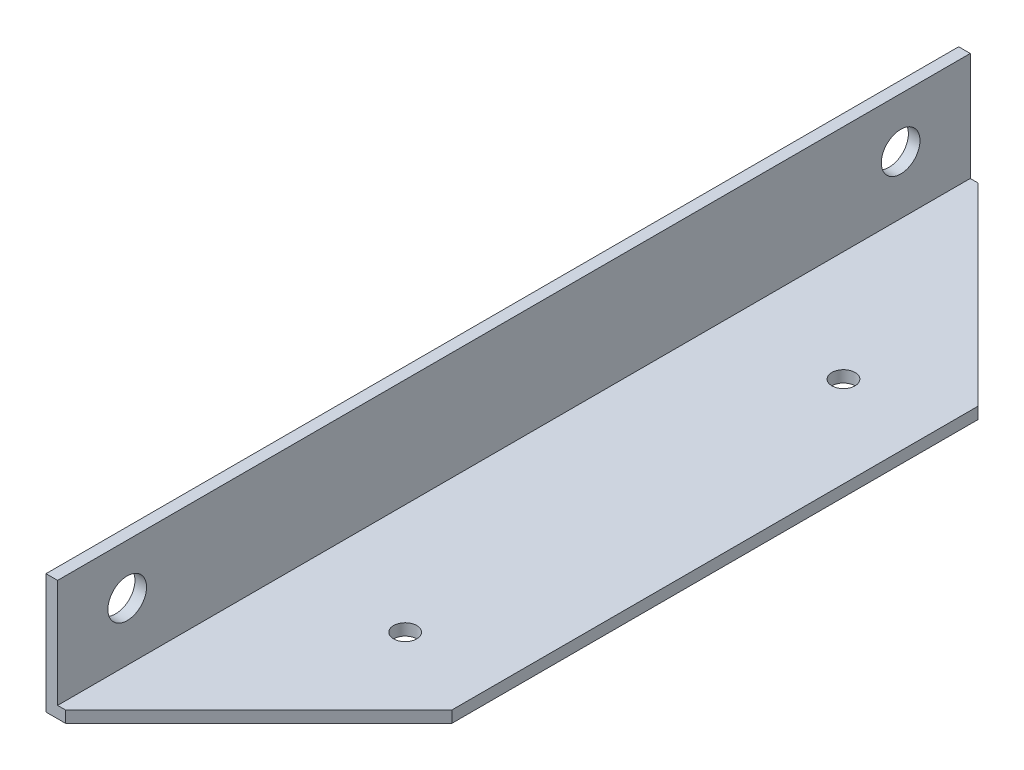
ISO-10303-21;
HEADER;
FILE_DESCRIPTION(('STEP AP214'),'2;1');
FILE_NAME('part.step','',(''),(''),'','','');
FILE_SCHEMA(('AUTOMOTIVE_DESIGN { 1 0 10303 214 1 1 1 1 }'));
ENDSEC;
DATA;
#1=APPLICATION_CONTEXT('core data for automotive mechanical design processes');
#2=APPLICATION_PROTOCOL_DEFINITION('international standard','automotive_design',2000,#1);
#3=PRODUCT_CONTEXT('',#1,'mechanical');
#4=PRODUCT('Part','Part','',(#3));
#5=PRODUCT_RELATED_PRODUCT_CATEGORY('part','',(#4));
#6=PRODUCT_DEFINITION_FORMATION('','',#4);
#7=PRODUCT_DEFINITION_CONTEXT('part definition',#1,'design');
#8=PRODUCT_DEFINITION('design','',#6,#7);
#9=PRODUCT_DEFINITION_SHAPE('','',#8);
#10=(LENGTH_UNIT() NAMED_UNIT(*) SI_UNIT(.MILLI.,.METRE.));
#11=(NAMED_UNIT(*) PLANE_ANGLE_UNIT() SI_UNIT($,.RADIAN.));
#12=(NAMED_UNIT(*) SI_UNIT($,.STERADIAN.) SOLID_ANGLE_UNIT());
#13=UNCERTAINTY_MEASURE_WITH_UNIT(LENGTH_MEASURE(1.E-05),#10,'distance_accuracy_value','');
#14=(GEOMETRIC_REPRESENTATION_CONTEXT(3) GLOBAL_UNCERTAINTY_ASSIGNED_CONTEXT((#13)) GLOBAL_UNIT_ASSIGNED_CONTEXT((#10,
#11,#12)) REPRESENTATION_CONTEXT('',''));
#15=CARTESIAN_POINT('',(0.,0.,0.));
#16=DIRECTION('',(0.,0.,1.));
#17=DIRECTION('',(1.,0.,0.));
#18=AXIS2_PLACEMENT_3D('',#15,#16,#17);
#19=CARTESIAN_POINT('',(0.,0.,118.));
#20=DIRECTION('',(0.,1.,0.));
#21=DIRECTION('',(0.,0.,1.));
#22=AXIS2_PLACEMENT_3D('',#19,#20,#21);
#23=PLANE('',#22);
#24=CARTESIAN_POINT('',(15.7716367419783,0.,87.3351358134159));
#25=DIRECTION('',(0.,-1.,0.));
#26=DIRECTION('',(0.,0.,1.));
#27=AXIS2_PLACEMENT_3D('',#24,#25,#26);
#28=CIRCLE('',#27,1.5);
#29=CARTESIAN_POINT('',(15.7716367419783,0.,88.8351358134159));
#30=VERTEX_POINT('',#29);
#31=EDGE_CURVE('E157',#30,#30,#28,.T.);
#32=ORIENTED_EDGE('',*,*,#31,.F.);
#33=EDGE_LOOP('',(#32));
#34=FACE_BOUND('',#33,.T.);
#35=CARTESIAN_POINT('',(15.7716367419783,0.,30.6648641865841));
#36=DIRECTION('',(0.,-1.,0.));
#37=DIRECTION('',(0.,0.,-1.));
#38=AXIS2_PLACEMENT_3D('',#35,#36,#37);
#39=CIRCLE('',#38,1.5);
#40=CARTESIAN_POINT('',(15.7716367419783,0.,29.1648641865841));
#41=VERTEX_POINT('',#40);
#42=EDGE_CURVE('E153',#41,#41,#39,.T.);
#43=ORIENTED_EDGE('',*,*,#42,.F.);
#44=EDGE_LOOP('',(#43));
#45=FACE_BOUND('',#44,.T.);
#46=DIRECTION('',(0.,0.,-1.));
#47=VECTOR('',#46,1.);
#48=CARTESIAN_POINT('',(27.5,0.,118.));
#49=LINE('',#48,#47);
#50=CARTESIAN_POINT('',(27.5,0.,93.));
#51=VERTEX_POINT('',#50);
#52=CARTESIAN_POINT('',(27.5,0.,25.0000000000001));
#53=VERTEX_POINT('',#52);
#54=EDGE_CURVE('E145',#51,#53,#49,.T.);
#55=ORIENTED_EDGE('',*,*,#54,.F.);
#56=DIRECTION('',(-0.707106781186549,0.,0.707106781186546));
#57=VECTOR('',#56,1.);
#58=CARTESIAN_POINT('',(27.5,0.,93.));
#59=LINE('',#58,#57);
#60=CARTESIAN_POINT('',(2.49999999999988,0.,118.));
#61=VERTEX_POINT('',#60);
#62=EDGE_CURVE('E164',#51,#61,#59,.T.);
#63=ORIENTED_EDGE('',*,*,#62,.T.);
#64=DIRECTION('',(1.,0.,0.));
#65=VECTOR('',#64,1.);
#66=CARTESIAN_POINT('',(0.,0.,118.));
#67=LINE('',#66,#65);
#68=CARTESIAN_POINT('',(0.,0.,118.));
#69=VERTEX_POINT('',#68);
#70=EDGE_CURVE('E116',#69,#61,#67,.T.);
#71=ORIENTED_EDGE('',*,*,#70,.F.);
#72=DIRECTION('',(0.,0.,-1.));
#73=VECTOR('',#72,1.);
#74=CARTESIAN_POINT('',(0.,0.,118.));
#75=LINE('',#74,#73);
#76=CARTESIAN_POINT('',(0.,0.,0.));
#77=VERTEX_POINT('',#76);
#78=EDGE_CURVE('E126',#69,#77,#75,.T.);
#79=ORIENTED_EDGE('',*,*,#78,.T.);
#80=DIRECTION('',(1.,0.,0.));
#81=VECTOR('',#80,1.);
#82=CARTESIAN_POINT('',(0.,0.,0.));
#83=LINE('',#82,#81);
#84=CARTESIAN_POINT('',(2.49999999999999,0.,0.));
#85=VERTEX_POINT('',#84);
#86=EDGE_CURVE('E127',#77,#85,#83,.T.);
#87=ORIENTED_EDGE('',*,*,#86,.T.);
#88=DIRECTION('',(-0.707106781186546,0.,-0.707106781186549));
#89=VECTOR('',#88,1.);
#90=CARTESIAN_POINT('',(2.49999999999999,0.,0.));
#91=LINE('',#90,#89);
#92=EDGE_CURVE('E162',#85,#53,#91,.F.);
#93=ORIENTED_EDGE('',*,*,#92,.T.);
#94=EDGE_LOOP('',(#55,#63,#71,#79,#87,#93));
#95=FACE_BOUND('',#94,.T.);
#96=ADVANCED_FACE('F33',(#34,#45,#95),#23,.F.);
#97=CARTESIAN_POINT('',(27.5,1.5,118.));
#98=DIRECTION('',(1.,0.,0.));
#99=DIRECTION('',(0.,0.,-1.));
#100=AXIS2_PLACEMENT_3D('',#97,#98,#99);
#101=PLANE('',#100);
#102=DIRECTION('',(0.,0.,-1.));
#103=VECTOR('',#102,1.);
#104=CARTESIAN_POINT('',(27.5,1.5,118.));
#105=LINE('',#104,#103);
#106=CARTESIAN_POINT('',(27.5,1.5,93.));
#107=VERTEX_POINT('',#106);
#108=CARTESIAN_POINT('',(27.5,1.5,25.0000000000001));
#109=VERTEX_POINT('',#108);
#110=EDGE_CURVE('E108',#107,#109,#105,.T.);
#111=ORIENTED_EDGE('',*,*,#110,.F.);
#112=DIRECTION('',(0.,-1.,0.));
#113=VECTOR('',#112,1.);
#114=CARTESIAN_POINT('',(27.5,0.,93.));
#115=LINE('',#114,#113);
#116=EDGE_CURVE('E159',#107,#51,#115,.T.);
#117=ORIENTED_EDGE('',*,*,#116,.T.);
#118=ORIENTED_EDGE('',*,*,#54,.T.);
#119=DIRECTION('',(0.,1.,0.));
#120=VECTOR('',#119,1.);
#121=CARTESIAN_POINT('',(27.5,1.5,25.0000000000001));
#122=LINE('',#121,#120);
#123=EDGE_CURVE('E148',#53,#109,#122,.T.);
#124=ORIENTED_EDGE('',*,*,#123,.T.);
#125=EDGE_LOOP('',(#111,#117,#118,#124));
#126=FACE_BOUND('',#125,.T.);
#127=ADVANCED_FACE('F171',(#126),#101,.T.);
#128=CARTESIAN_POINT('',(0.,1.5,118.));
#129=DIRECTION('',(0.,1.,0.));
#130=DIRECTION('',(0.,0.,1.));
#131=AXIS2_PLACEMENT_3D('',#128,#129,#130);
#132=PLANE('',#131);
#133=CARTESIAN_POINT('',(15.7716367419783,1.5,87.3351358134159));
#134=DIRECTION('',(0.,1.,0.));
#135=DIRECTION('',(0.,0.,1.));
#136=AXIS2_PLACEMENT_3D('',#133,#134,#135);
#137=CIRCLE('',#136,1.5);
#138=CARTESIAN_POINT('',(15.7716367419783,1.5,88.8351358134159));
#139=VERTEX_POINT('',#138);
#140=EDGE_CURVE('E154',#139,#139,#137,.T.);
#141=ORIENTED_EDGE('',*,*,#140,.F.);
#142=EDGE_LOOP('',(#141));
#143=FACE_BOUND('',#142,.T.);
#144=CARTESIAN_POINT('',(15.7716367419783,1.5,30.6648641865841));
#145=DIRECTION('',(0.,1.,0.));
#146=DIRECTION('',(0.,0.,1.));
#147=AXIS2_PLACEMENT_3D('',#144,#145,#146);
#148=CIRCLE('',#147,1.5);
#149=CARTESIAN_POINT('',(15.7716367419783,1.5,32.1648641865841));
#150=VERTEX_POINT('',#149);
#151=EDGE_CURVE('E149',#150,#150,#148,.T.);
#152=ORIENTED_EDGE('',*,*,#151,.F.);
#153=EDGE_LOOP('',(#152));
#154=FACE_BOUND('',#153,.T.);
#155=DIRECTION('',(1.,0.,0.));
#156=VECTOR('',#155,1.);
#157=CARTESIAN_POINT('',(0.,1.5,118.));
#158=LINE('',#157,#156);
#159=CARTESIAN_POINT('',(1.5,1.5,118.));
#160=VERTEX_POINT('',#159);
#161=CARTESIAN_POINT('',(2.49999999999988,1.5,118.));
#162=VERTEX_POINT('',#161);
#163=EDGE_CURVE('E101',#160,#162,#158,.T.);
#164=ORIENTED_EDGE('',*,*,#163,.T.);
#165=DIRECTION('',(0.707106781186549,0.,-0.707106781186546));
#166=VECTOR('',#165,1.);
#167=CARTESIAN_POINT('',(1.24999999999993,1.5,119.25));
#168=LINE('',#167,#166);
#169=EDGE_CURVE('E41',#162,#107,#168,.T.);
#170=ORIENTED_EDGE('',*,*,#169,.T.);
#171=ORIENTED_EDGE('',*,*,#110,.T.);
#172=DIRECTION('',(0.707106781186546,0.,0.707106781186549));
#173=VECTOR('',#172,1.);
#174=CARTESIAN_POINT('',(60.25,1.5,57.7500000000002));
#175=LINE('',#174,#173);
#176=CARTESIAN_POINT('',(2.49999999999998,1.5,0.));
#177=VERTEX_POINT('',#176);
#178=EDGE_CURVE('E48',#109,#177,#175,.F.);
#179=ORIENTED_EDGE('',*,*,#178,.T.);
#180=DIRECTION('',(1.,0.,0.));
#181=VECTOR('',#180,1.);
#182=CARTESIAN_POINT('',(0.,1.5,0.));
#183=LINE('',#182,#181);
#184=CARTESIAN_POINT('',(1.5,1.5,0.));
#185=VERTEX_POINT('',#184);
#186=EDGE_CURVE('E103',#185,#177,#183,.T.);
#187=ORIENTED_EDGE('',*,*,#186,.F.);
#188=DIRECTION('',(0.,0.,-1.));
#189=VECTOR('',#188,1.);
#190=CARTESIAN_POINT('',(1.5,1.5,118.));
#191=LINE('',#190,#189);
#192=EDGE_CURVE('E99',#160,#185,#191,.T.);
#193=ORIENTED_EDGE('',*,*,#192,.F.);
#194=EDGE_LOOP('',(#164,#170,#171,#179,#187,#193));
#195=FACE_BOUND('',#194,.T.);
#196=ADVANCED_FACE('F100',(#143,#154,#195),#132,.T.);
#197=CARTESIAN_POINT('',(1.5,15.5,118.));
#198=DIRECTION('',(1.,0.,0.));
#199=DIRECTION('',(0.,1.,0.));
#200=AXIS2_PLACEMENT_3D('',#197,#198,#199);
#201=PLANE('',#200);
#202=CARTESIAN_POINT('',(1.5,8.99999999999999,109.));
#203=DIRECTION('',(1.,0.,0.));
#204=DIRECTION('',(0.,1.,0.));
#205=AXIS2_PLACEMENT_3D('',#202,#203,#204);
#206=CIRCLE('',#205,2.49999999999999);
#207=CARTESIAN_POINT('',(1.5,11.5,109.));
#208=VERTEX_POINT('',#207);
#209=EDGE_CURVE('E185',#208,#208,#206,.T.);
#210=ORIENTED_EDGE('',*,*,#209,.F.);
#211=EDGE_LOOP('',(#210));
#212=FACE_BOUND('',#211,.T.);
#213=CARTESIAN_POINT('',(1.5,8.99999999999998,8.99999999999999));
#214=DIRECTION('',(1.,0.,0.));
#215=DIRECTION('',(0.,1.,0.));
#216=AXIS2_PLACEMENT_3D('',#213,#214,#215);
#217=CIRCLE('',#216,2.5);
#218=CARTESIAN_POINT('',(1.5,11.5,8.99999999999999));
#219=VERTEX_POINT('',#218);
#220=EDGE_CURVE('E130',#219,#219,#217,.T.);
#221=ORIENTED_EDGE('',*,*,#220,.F.);
#222=EDGE_LOOP('',(#221));
#223=FACE_BOUND('',#222,.T.);
#224=DIRECTION('',(0.,-1.,0.));
#225=VECTOR('',#224,1.);
#226=CARTESIAN_POINT('',(1.5,15.5,0.));
#227=LINE('',#226,#225);
#228=CARTESIAN_POINT('',(1.5,15.5,0.));
#229=VERTEX_POINT('',#228);
#230=EDGE_CURVE('E132',#229,#185,#227,.T.);
#231=ORIENTED_EDGE('',*,*,#230,.F.);
#232=DIRECTION('',(0.,0.,-1.));
#233=VECTOR('',#232,1.);
#234=CARTESIAN_POINT('',(1.5,15.5,118.));
#235=LINE('',#234,#233);
#236=CARTESIAN_POINT('',(1.5,15.5,118.));
#237=VERTEX_POINT('',#236);
#238=EDGE_CURVE('E109',#237,#229,#235,.T.);
#239=ORIENTED_EDGE('',*,*,#238,.F.);
#240=DIRECTION('',(0.,-1.,0.));
#241=VECTOR('',#240,1.);
#242=CARTESIAN_POINT('',(1.5,15.5,118.));
#243=LINE('',#242,#241);
#244=EDGE_CURVE('E114',#237,#160,#243,.T.);
#245=ORIENTED_EDGE('',*,*,#244,.T.);
#246=ORIENTED_EDGE('',*,*,#192,.T.);
#247=EDGE_LOOP('',(#231,#239,#245,#246));
#248=FACE_BOUND('',#247,.T.);
#249=ADVANCED_FACE('F118',(#212,#223,#248),#201,.T.);
#250=CARTESIAN_POINT('',(0.,15.5,118.));
#251=DIRECTION('',(0.,1.,0.));
#252=DIRECTION('',(0.,0.,1.));
#253=AXIS2_PLACEMENT_3D('',#250,#251,#252);
#254=PLANE('',#253);
#255=DIRECTION('',(1.,0.,0.));
#256=VECTOR('',#255,1.);
#257=CARTESIAN_POINT('',(0.,15.5,0.));
#258=LINE('',#257,#256);
#259=CARTESIAN_POINT('',(0.,15.5,0.));
#260=VERTEX_POINT('',#259);
#261=EDGE_CURVE('E134',#260,#229,#258,.T.);
#262=ORIENTED_EDGE('',*,*,#261,.F.);
#263=DIRECTION('',(0.,0.,-1.));
#264=VECTOR('',#263,1.);
#265=CARTESIAN_POINT('',(0.,15.5,118.));
#266=LINE('',#265,#264);
#267=CARTESIAN_POINT('',(0.,15.5,118.));
#268=VERTEX_POINT('',#267);
#269=EDGE_CURVE('E141',#268,#260,#266,.T.);
#270=ORIENTED_EDGE('',*,*,#269,.F.);
#271=DIRECTION('',(1.,0.,0.));
#272=VECTOR('',#271,1.);
#273=CARTESIAN_POINT('',(0.,15.5,118.));
#274=LINE('',#273,#272);
#275=EDGE_CURVE('E119',#268,#237,#274,.T.);
#276=ORIENTED_EDGE('',*,*,#275,.T.);
#277=ORIENTED_EDGE('',*,*,#238,.T.);
#278=EDGE_LOOP('',(#262,#270,#276,#277));
#279=FACE_BOUND('',#278,.T.);
#280=ADVANCED_FACE('F229',(#279),#254,.T.);
#281=CARTESIAN_POINT('',(0.,15.5,118.));
#282=DIRECTION('',(1.,0.,0.));
#283=DIRECTION('',(0.,1.,0.));
#284=AXIS2_PLACEMENT_3D('',#281,#282,#283);
#285=PLANE('',#284);
#286=CARTESIAN_POINT('',(0.,8.99999999999999,109.));
#287=DIRECTION('',(-1.,0.,0.));
#288=DIRECTION('',(0.,1.,0.));
#289=AXIS2_PLACEMENT_3D('',#286,#287,#288);
#290=CIRCLE('',#289,2.49999999999999);
#291=CARTESIAN_POINT('',(0.,11.5,109.));
#292=VERTEX_POINT('',#291);
#293=EDGE_CURVE('E152',#292,#292,#290,.T.);
#294=ORIENTED_EDGE('',*,*,#293,.F.);
#295=EDGE_LOOP('',(#294));
#296=FACE_BOUND('',#295,.T.);
#297=CARTESIAN_POINT('',(0.,8.99999999999998,8.99999999999999));
#298=DIRECTION('',(-1.,0.,0.));
#299=DIRECTION('',(0.,-1.,0.));
#300=AXIS2_PLACEMENT_3D('',#297,#298,#299);
#301=CIRCLE('',#300,2.5);
#302=CARTESIAN_POINT('',(0.,6.49999999999998,8.99999999999999));
#303=VERTEX_POINT('',#302);
#304=EDGE_CURVE('E182',#303,#303,#301,.T.);
#305=ORIENTED_EDGE('',*,*,#304,.F.);
#306=EDGE_LOOP('',(#305));
#307=FACE_BOUND('',#306,.T.);
#308=DIRECTION('',(0.,-1.,0.));
#309=VECTOR('',#308,1.);
#310=CARTESIAN_POINT('',(0.,15.5,0.));
#311=LINE('',#310,#309);
#312=EDGE_CURVE('E137',#260,#77,#311,.T.);
#313=ORIENTED_EDGE('',*,*,#312,.T.);
#314=ORIENTED_EDGE('',*,*,#78,.F.);
#315=DIRECTION('',(0.,-1.,0.));
#316=VECTOR('',#315,1.);
#317=CARTESIAN_POINT('',(0.,15.5,118.));
#318=LINE('',#317,#316);
#319=EDGE_CURVE('E121',#268,#69,#318,.T.);
#320=ORIENTED_EDGE('',*,*,#319,.F.);
#321=ORIENTED_EDGE('',*,*,#269,.T.);
#322=EDGE_LOOP('',(#313,#314,#320,#321));
#323=FACE_BOUND('',#322,.T.);
#324=ADVANCED_FACE('F223',(#296,#307,#323),#285,.F.);
#325=CARTESIAN_POINT('',(0.,0.,118.));
#326=DIRECTION('',(0.,0.,-1.));
#327=DIRECTION('',(-1.,0.,0.));
#328=AXIS2_PLACEMENT_3D('',#325,#326,#327);
#329=PLANE('',#328);
#330=ORIENTED_EDGE('',*,*,#70,.T.);
#331=DIRECTION('',(0.,1.,0.));
#332=VECTOR('',#331,1.);
#333=CARTESIAN_POINT('',(2.49999999999988,1.5,118.));
#334=LINE('',#333,#332);
#335=EDGE_CURVE('E56',#61,#162,#334,.T.);
#336=ORIENTED_EDGE('',*,*,#335,.T.);
#337=ORIENTED_EDGE('',*,*,#163,.F.);
#338=ORIENTED_EDGE('',*,*,#244,.F.);
#339=ORIENTED_EDGE('',*,*,#275,.F.);
#340=ORIENTED_EDGE('',*,*,#319,.T.);
#341=EDGE_LOOP('',(#330,#336,#337,#338,#339,#340));
#342=FACE_BOUND('',#341,.T.);
#343=ADVANCED_FACE('F112',(#342),#329,.F.);
#344=CARTESIAN_POINT('',(0.,0.,0.));
#345=DIRECTION('',(0.,0.,-1.));
#346=DIRECTION('',(-1.,0.,0.));
#347=AXIS2_PLACEMENT_3D('',#344,#345,#346);
#348=PLANE('',#347);
#349=ORIENTED_EDGE('',*,*,#186,.T.);
#350=DIRECTION('',(0.,-1.,0.));
#351=VECTOR('',#350,1.);
#352=CARTESIAN_POINT('',(2.49999999999999,0.,0.));
#353=LINE('',#352,#351);
#354=EDGE_CURVE('E11',#177,#85,#353,.T.);
#355=ORIENTED_EDGE('',*,*,#354,.T.);
#356=ORIENTED_EDGE('',*,*,#86,.F.);
#357=ORIENTED_EDGE('',*,*,#312,.F.);
#358=ORIENTED_EDGE('',*,*,#261,.T.);
#359=ORIENTED_EDGE('',*,*,#230,.T.);
#360=EDGE_LOOP('',(#349,#355,#356,#357,#358,#359));
#361=FACE_BOUND('',#360,.T.);
#362=ADVANCED_FACE('F219',(#361),#348,.T.);
#363=CARTESIAN_POINT('',(4.,8.99999999999998,8.99999999999999));
#364=DIRECTION('',(-1.,0.,0.));
#365=DIRECTION('',(0.,-1.,0.));
#366=AXIS2_PLACEMENT_3D('',#363,#364,#365);
#367=CYLINDRICAL_SURFACE('',#366,2.5);
#368=ORIENTED_EDGE('',*,*,#220,.T.);
#369=EDGE_LOOP('',(#368));
#370=FACE_BOUND('',#369,.T.);
#371=ORIENTED_EDGE('',*,*,#304,.T.);
#372=EDGE_LOOP('',(#371));
#373=FACE_BOUND('',#372,.T.);
#374=ADVANCED_FACE('F213',(#370,#373),#367,.F.);
#375=CARTESIAN_POINT('',(4.,8.99999999999999,109.));
#376=DIRECTION('',(-1.,0.,0.));
#377=DIRECTION('',(0.,-1.,0.));
#378=AXIS2_PLACEMENT_3D('',#375,#376,#377);
#379=CYLINDRICAL_SURFACE('',#378,2.49999999999999);
#380=ORIENTED_EDGE('',*,*,#209,.T.);
#381=EDGE_LOOP('',(#380));
#382=FACE_BOUND('',#381,.T.);
#383=ORIENTED_EDGE('',*,*,#293,.T.);
#384=EDGE_LOOP('',(#383));
#385=FACE_BOUND('',#384,.T.);
#386=ADVANCED_FACE('F204',(#382,#385),#379,.F.);
#387=CARTESIAN_POINT('',(15.7716367419783,4.,30.6648641865841));
#388=DIRECTION('',(0.,-1.,0.));
#389=DIRECTION('',(0.,0.,-1.));
#390=AXIS2_PLACEMENT_3D('',#387,#388,#389);
#391=CYLINDRICAL_SURFACE('',#390,1.5);
#392=ORIENTED_EDGE('',*,*,#151,.T.);
#393=EDGE_LOOP('',(#392));
#394=FACE_BOUND('',#393,.T.);
#395=ORIENTED_EDGE('',*,*,#42,.T.);
#396=EDGE_LOOP('',(#395));
#397=FACE_BOUND('',#396,.T.);
#398=ADVANCED_FACE('F202',(#394,#397),#391,.F.);
#399=CARTESIAN_POINT('',(15.7716367419783,4.,87.3351358134159));
#400=DIRECTION('',(0.,-1.,0.));
#401=DIRECTION('',(0.,0.,-1.));
#402=AXIS2_PLACEMENT_3D('',#399,#400,#401);
#403=CYLINDRICAL_SURFACE('',#402,1.5);
#404=ORIENTED_EDGE('',*,*,#140,.T.);
#405=EDGE_LOOP('',(#404));
#406=FACE_BOUND('',#405,.T.);
#407=ORIENTED_EDGE('',*,*,#31,.T.);
#408=EDGE_LOOP('',(#407));
#409=FACE_BOUND('',#408,.T.);
#410=ADVANCED_FACE('F195',(#406,#409),#403,.F.);
#411=CARTESIAN_POINT('',(27.5,1.5,93.));
#412=DIRECTION('',(0.707106781186546,0.,0.707106781186549));
#413=DIRECTION('',(0.,1.,0.));
#414=AXIS2_PLACEMENT_3D('',#411,#412,#413);
#415=PLANE('',#414);
#416=ORIENTED_EDGE('',*,*,#169,.F.);
#417=ORIENTED_EDGE('',*,*,#335,.F.);
#418=ORIENTED_EDGE('',*,*,#62,.F.);
#419=ORIENTED_EDGE('',*,*,#116,.F.);
#420=EDGE_LOOP('',(#416,#417,#418,#419));
#421=FACE_BOUND('',#420,.T.);
#422=ADVANCED_FACE('F174',(#421),#415,.T.);
#423=CARTESIAN_POINT('',(2.49999999999999,0.,0.));
#424=DIRECTION('',(-0.707106781186549,0.,0.707106781186546));
#425=DIRECTION('',(0.,-1.,0.));
#426=AXIS2_PLACEMENT_3D('',#423,#424,#425);
#427=PLANE('',#426);
#428=ORIENTED_EDGE('',*,*,#178,.F.);
#429=ORIENTED_EDGE('',*,*,#123,.F.);
#430=ORIENTED_EDGE('',*,*,#92,.F.);
#431=ORIENTED_EDGE('',*,*,#354,.F.);
#432=EDGE_LOOP('',(#428,#429,#430,#431));
#433=FACE_BOUND('',#432,.T.);
#434=ADVANCED_FACE('F35',(#433),#427,.F.);
#435=CLOSED_SHELL('',(#96,#127,#196,#249,#280,#324,#343,#362,#374,#386,#398,#410,#422,#434));
#436=MANIFOLD_SOLID_BREP('B2',#435);
#437=ADVANCED_BREP_SHAPE_REPRESENTATION('',(#18,#436),#14);
#438=SHAPE_DEFINITION_REPRESENTATION(#9,#437);
ENDSEC;
END-ISO-10303-21;
